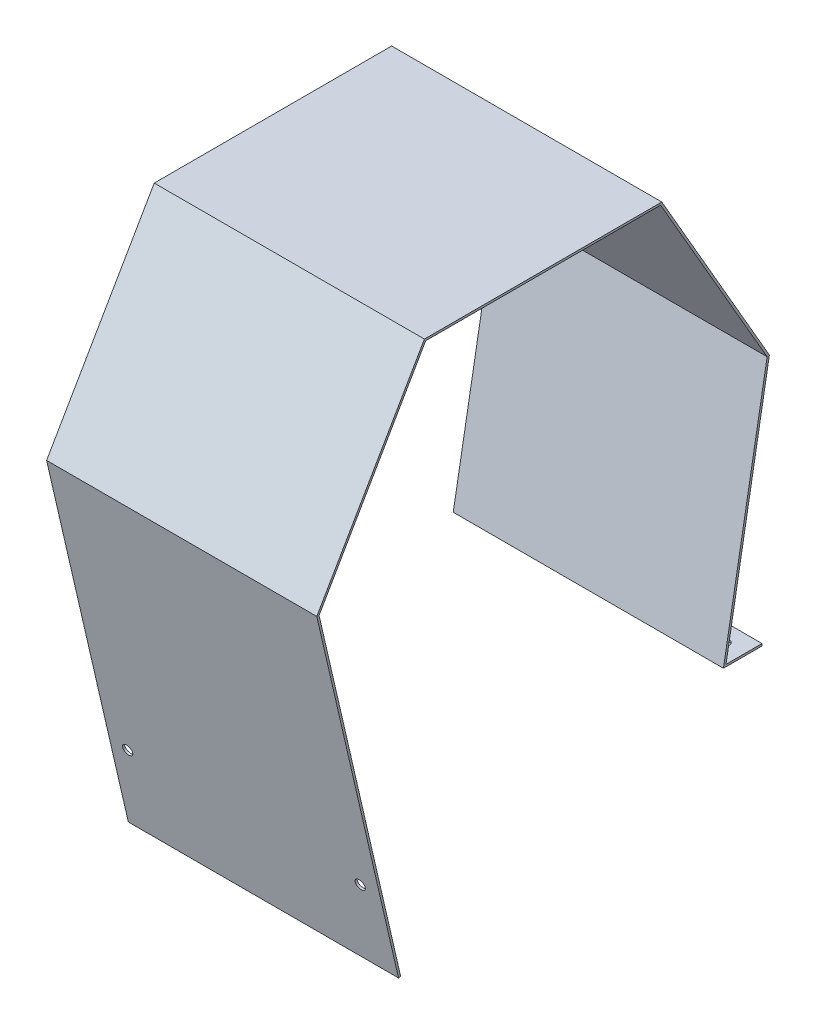
ISO-10303-21;
HEADER;
FILE_DESCRIPTION(('STEP AP214'),'2;1');
FILE_NAME('part.step','',(''),(''),'','','');
FILE_SCHEMA(('AUTOMOTIVE_DESIGN { 1 0 10303 214 1 1 1 1 }'));
ENDSEC;
DATA;
#1=APPLICATION_CONTEXT('core data for automotive mechanical design processes');
#2=APPLICATION_PROTOCOL_DEFINITION('international standard','automotive_design',2000,#1);
#3=PRODUCT_CONTEXT('',#1,'mechanical');
#4=PRODUCT('Part','Part','',(#3));
#5=PRODUCT_RELATED_PRODUCT_CATEGORY('part','',(#4));
#6=PRODUCT_DEFINITION_FORMATION('','',#4);
#7=PRODUCT_DEFINITION_CONTEXT('part definition',#1,'design');
#8=PRODUCT_DEFINITION('design','',#6,#7);
#9=PRODUCT_DEFINITION_SHAPE('','',#8);
#10=(LENGTH_UNIT() NAMED_UNIT(*) SI_UNIT(.MILLI.,.METRE.));
#11=(NAMED_UNIT(*) PLANE_ANGLE_UNIT() SI_UNIT($,.RADIAN.));
#12=(NAMED_UNIT(*) SI_UNIT($,.STERADIAN.) SOLID_ANGLE_UNIT());
#13=UNCERTAINTY_MEASURE_WITH_UNIT(LENGTH_MEASURE(1.E-05),#10,'distance_accuracy_value','');
#14=(GEOMETRIC_REPRESENTATION_CONTEXT(3) GLOBAL_UNCERTAINTY_ASSIGNED_CONTEXT((#13)) GLOBAL_UNIT_ASSIGNED_CONTEXT((#10,
#11,#12)) REPRESENTATION_CONTEXT('',''));
#15=CARTESIAN_POINT('',(0.,0.,0.));
#16=DIRECTION('',(0.,0.,1.));
#17=DIRECTION('',(1.,0.,0.));
#18=AXIS2_PLACEMENT_3D('',#15,#16,#17);
#19=CARTESIAN_POINT('',(-80.1675999299616,603.456840762097,-746.2089681282));
#20=DIRECTION('',(0.,-0.500000000000005,-0.866025403784436));
#21=DIRECTION('',(0.,0.866025403784436,-0.500000000000005));
#22=AXIS2_PLACEMENT_3D('',#19,#20,#21);
#23=PLANE('',#22);
#24=DIRECTION('',(1.,0.,0.));
#25=VECTOR('',#24,1.);
#26=CARTESIAN_POINT('',(-80.1675999299616,603.456840762097,-746.2089681282));
#27=LINE('',#26,#25);
#28=CARTESIAN_POINT('',(-80.1675999299616,603.456840762097,-746.2089681282));
#29=VERTEX_POINT('',#28);
#30=CARTESIAN_POINT('',(80.8324000700384,603.456840762097,-746.2089681282));
#31=VERTEX_POINT('',#30);
#32=EDGE_CURVE('E135',#29,#31,#27,.T.);
#33=ORIENTED_EDGE('',*,*,#32,.T.);
#34=DIRECTION('',(0.,0.866025403784436,-0.500000000000005));
#35=VECTOR('',#34,1.);
#36=CARTESIAN_POINT('',(80.8324000700384,603.456840762097,-746.2089681282));
#37=LINE('',#36,#35);
#38=CARTESIAN_POINT('',(80.8324000700384,493.471614481473,-682.7089681282));
#39=VERTEX_POINT('',#38);
#40=EDGE_CURVE('E138',#39,#31,#37,.T.);
#41=ORIENTED_EDGE('',*,*,#40,.F.);
#42=DIRECTION('',(1.,0.,0.));
#43=VECTOR('',#42,1.);
#44=CARTESIAN_POINT('',(-80.1675999299616,493.471614481473,-682.7089681282));
#45=LINE('',#44,#43);
#46=CARTESIAN_POINT('',(-80.1675999299616,493.471614481473,-682.7089681282));
#47=VERTEX_POINT('',#46);
#48=EDGE_CURVE('E11',#47,#39,#45,.T.);
#49=ORIENTED_EDGE('',*,*,#48,.F.);
#50=DIRECTION('',(0.,0.866025403784436,-0.500000000000005));
#51=VECTOR('',#50,1.);
#52=CARTESIAN_POINT('',(-80.1675999299616,603.456840762097,-746.2089681282));
#53=LINE('',#52,#51);
#54=EDGE_CURVE('E139',#47,#29,#53,.T.);
#55=ORIENTED_EDGE('',*,*,#54,.T.);
#56=EDGE_LOOP('',(#33,#41,#49,#55));
#57=FACE_BOUND('',#56,.T.);
#58=ADVANCED_FACE('F37',(#57),#23,.T.);
#59=CARTESIAN_POINT('',(-80.1675999299616,493.471614481473,-682.7089681282));
#60=DIRECTION('',(0.,0.224951054343861,-0.974370064785236));
#61=DIRECTION('',(0.,0.974370064785236,0.224951054343861));
#62=AXIS2_PLACEMENT_3D('',#59,#60,#61);
#63=PLANE('',#62);
#64=CARTESIAN_POINT('',(69.0000000001624,330.707852502616,-720.28594343705));
#65=DIRECTION('',(0.,0.224951054343861,-0.974370064785236));
#66=DIRECTION('',(0.,0.974370064785236,0.224951054343861));
#67=AXIS2_PLACEMENT_3D('',#64,#65,#66);
#68=CIRCLE('',#67,3.00000000000001);
#69=CARTESIAN_POINT('',(69.0000000001624,333.630962696971,-719.611090274018));
#70=VERTEX_POINT('',#69);
#71=EDGE_CURVE('E261',#70,#70,#68,.T.);
#72=ORIENTED_EDGE('',*,*,#71,.F.);
#73=EDGE_LOOP('',(#72));
#74=FACE_BOUND('',#73,.T.);
#75=CARTESIAN_POINT('',(-69.4999999998664,330.993163089172,-720.220074298022));
#76=DIRECTION('',(0.,0.224951054343861,-0.974370064785236));
#77=DIRECTION('',(0.,0.974370064785236,0.224951054343861));
#78=AXIS2_PLACEMENT_3D('',#75,#76,#77);
#79=CIRCLE('',#78,3.00000000000001);
#80=CARTESIAN_POINT('',(-69.4999999998664,333.916273283528,-719.545221134991));
#81=VERTEX_POINT('',#80);
#82=EDGE_CURVE('E265',#81,#81,#79,.T.);
#83=ORIENTED_EDGE('',*,*,#82,.F.);
#84=EDGE_LOOP('',(#83));
#85=FACE_BOUND('',#84,.T.);
#86=ORIENTED_EDGE('',*,*,#48,.T.);
#87=DIRECTION('',(0.,0.974370064785236,0.224951054343861));
#88=VECTOR('',#87,1.);
#89=CARTESIAN_POINT('',(80.8324000700384,493.471614481473,-682.7089681282));
#90=LINE('',#89,#88);
#91=CARTESIAN_POINT('',(80.8324000700383,283.007680487862,-731.298395866474));
#92=VERTEX_POINT('',#91);
#93=EDGE_CURVE('E157',#92,#39,#90,.T.);
#94=ORIENTED_EDGE('',*,*,#93,.F.);
#95=DIRECTION('',(1.,0.,0.));
#96=VECTOR('',#95,1.);
#97=CARTESIAN_POINT('',(-80.1675999299617,283.007680487862,-731.298395866474));
#98=LINE('',#97,#96);
#99=CARTESIAN_POINT('',(-80.1675999299617,283.007680487862,-731.298395866474));
#100=VERTEX_POINT('',#99);
#101=EDGE_CURVE('E45',#100,#92,#98,.T.);
#102=ORIENTED_EDGE('',*,*,#101,.F.);
#103=DIRECTION('',(0.,0.974370064785236,0.224951054343861));
#104=VECTOR('',#103,1.);
#105=CARTESIAN_POINT('',(-80.1675999299616,493.471614481473,-682.7089681282));
#106=LINE('',#105,#104);
#107=EDGE_CURVE('E144',#100,#47,#106,.T.);
#108=ORIENTED_EDGE('',*,*,#107,.T.);
#109=EDGE_LOOP('',(#86,#94,#102,#108));
#110=FACE_BOUND('',#109,.T.);
#111=ADVANCED_FACE('F294',(#74,#85,#110),#63,.T.);
#112=CARTESIAN_POINT('',(-80.1675999299617,283.007680487862,-731.298395866474));
#113=DIRECTION('',(0.,-0.974370064785224,-0.224951054343913));
#114=DIRECTION('',(0.,0.224951054343913,-0.974370064785224));
#115=AXIS2_PLACEMENT_3D('',#112,#113,#114);
#116=PLANE('',#115);
#117=ORIENTED_EDGE('',*,*,#101,.T.);
#118=DIRECTION('',(0.,0.224951054343913,-0.974370064785224));
#119=VECTOR('',#118,1.);
#120=CARTESIAN_POINT('',(80.8324000700383,283.007680487862,-731.298395866474));
#121=LINE('',#120,#119);
#122=CARTESIAN_POINT('',(80.8324000700383,282.721992648846,-730.060945884197));
#123=VERTEX_POINT('',#122);
#124=EDGE_CURVE('E193',#123,#92,#121,.T.);
#125=ORIENTED_EDGE('',*,*,#124,.F.);
#126=DIRECTION('',(1.,0.,0.));
#127=VECTOR('',#126,1.);
#128=CARTESIAN_POINT('',(-80.1675999299617,282.721992648846,-730.060945884197));
#129=LINE('',#128,#127);
#130=CARTESIAN_POINT('',(-80.1675999299617,282.721992648846,-730.060945884197));
#131=VERTEX_POINT('',#130);
#132=EDGE_CURVE('E233',#131,#123,#129,.T.);
#133=ORIENTED_EDGE('',*,*,#132,.F.);
#134=DIRECTION('',(0.,0.224951054343913,-0.974370064785224));
#135=VECTOR('',#134,1.);
#136=CARTESIAN_POINT('',(-80.1675999299617,283.007680487862,-731.298395866474));
#137=LINE('',#136,#135);
#138=EDGE_CURVE('E229',#131,#100,#137,.T.);
#139=ORIENTED_EDGE('',*,*,#138,.T.);
#140=EDGE_LOOP('',(#117,#125,#133,#139));
#141=FACE_BOUND('',#140,.T.);
#142=ADVANCED_FACE('F281',(#141),#116,.T.);
#143=CARTESIAN_POINT('',(-80.1675999299616,493.673371153525,-681.358982713378));
#144=DIRECTION('',(0.,-0.224951054343862,0.974370064785236));
#145=DIRECTION('',(0.,-0.974370064785236,-0.224951054343862));
#146=AXIS2_PLACEMENT_3D('',#143,#144,#145);
#147=PLANE('',#146);
#148=CARTESIAN_POINT('',(69.0000000001624,330.422164663599,-719.048493454772));
#149=DIRECTION('',(0.,-0.224951054343862,0.974370064785236));
#150=DIRECTION('',(0.,-0.974370064785236,-0.224951054343862));
#151=AXIS2_PLACEMENT_3D('',#148,#149,#150);
#152=CIRCLE('',#151,3.00000000000001);
#153=CARTESIAN_POINT('',(69.0000000001624,327.499054469243,-719.723346617804));
#154=VERTEX_POINT('',#153);
#155=EDGE_CURVE('E268',#154,#154,#152,.T.);
#156=ORIENTED_EDGE('',*,*,#155,.F.);
#157=EDGE_LOOP('',(#156));
#158=FACE_BOUND('',#157,.T.);
#159=CARTESIAN_POINT('',(-69.4999999998664,330.707475250155,-718.982624315745));
#160=DIRECTION('',(0.,-0.224951054343862,0.974370064785236));
#161=DIRECTION('',(0.,-0.974370064785236,-0.224951054343862));
#162=AXIS2_PLACEMENT_3D('',#159,#160,#161);
#163=CIRCLE('',#162,3.00000000000001);
#164=CARTESIAN_POINT('',(-69.4999999998664,327.7843650558,-719.657477478777));
#165=VERTEX_POINT('',#164);
#166=EDGE_CURVE('E269',#165,#165,#163,.T.);
#167=ORIENTED_EDGE('',*,*,#166,.F.);
#168=EDGE_LOOP('',(#167));
#169=FACE_BOUND('',#168,.T.);
#170=ORIENTED_EDGE('',*,*,#132,.T.);
#171=DIRECTION('',(0.,-0.974370064785236,-0.224951054343862));
#172=VECTOR('',#171,1.);
#173=CARTESIAN_POINT('',(80.8324000700384,493.673371153525,-681.358982713378));
#174=LINE('',#173,#172);
#175=CARTESIAN_POINT('',(80.8324000700384,493.673371153525,-681.358982713378));
#176=VERTEX_POINT('',#175);
#177=EDGE_CURVE('E190',#176,#123,#174,.T.);
#178=ORIENTED_EDGE('',*,*,#177,.F.);
#179=DIRECTION('',(1.,0.,0.));
#180=VECTOR('',#179,1.);
#181=CARTESIAN_POINT('',(-80.1675999299616,493.673371153525,-681.358982713378));
#182=LINE('',#181,#180);
#183=CARTESIAN_POINT('',(-80.1675999299616,493.673371153525,-681.358982713378));
#184=VERTEX_POINT('',#183);
#185=EDGE_CURVE('E235',#184,#176,#182,.T.);
#186=ORIENTED_EDGE('',*,*,#185,.F.);
#187=DIRECTION('',(0.,-0.974370064785236,-0.224951054343862));
#188=VECTOR('',#187,1.);
#189=CARTESIAN_POINT('',(-80.1675999299616,493.673371153525,-681.358982713378));
#190=LINE('',#189,#188);
#191=EDGE_CURVE('E226',#184,#131,#190,.T.);
#192=ORIENTED_EDGE('',*,*,#191,.T.);
#193=EDGE_LOOP('',(#170,#178,#186,#192));
#194=FACE_BOUND('',#193,.T.);
#195=ADVANCED_FACE('F277',(#158,#169,#194),#147,.T.);
#196=CARTESIAN_POINT('',(-80.1675999299616,604.726840762097,-745.475733286329));
#197=DIRECTION('',(0.,0.500000000000003,0.866025403784437));
#198=DIRECTION('',(0.,-0.866025403784437,0.500000000000003));
#199=AXIS2_PLACEMENT_3D('',#196,#197,#198);
#200=PLANE('',#199);
#201=ORIENTED_EDGE('',*,*,#185,.T.);
#202=DIRECTION('',(0.,-0.866025403784437,0.500000000000003));
#203=VECTOR('',#202,1.);
#204=CARTESIAN_POINT('',(80.8324000700384,604.726840762097,-745.475733286329));
#205=LINE('',#204,#203);
#206=CARTESIAN_POINT('',(80.8324000700384,604.726840762097,-745.475733286329));
#207=VERTEX_POINT('',#206);
#208=EDGE_CURVE('E187',#207,#176,#205,.T.);
#209=ORIENTED_EDGE('',*,*,#208,.F.);
#210=DIRECTION('',(1.,0.,0.));
#211=VECTOR('',#210,1.);
#212=CARTESIAN_POINT('',(-80.1675999299616,604.726840762097,-745.475733286329));
#213=LINE('',#212,#211);
#214=CARTESIAN_POINT('',(-80.1675999299616,604.726840762097,-745.475733286329));
#215=VERTEX_POINT('',#214);
#216=EDGE_CURVE('E237',#215,#207,#213,.T.);
#217=ORIENTED_EDGE('',*,*,#216,.F.);
#218=DIRECTION('',(0.,-0.866025403784437,0.500000000000003));
#219=VECTOR('',#218,1.);
#220=CARTESIAN_POINT('',(-80.1675999299616,604.726840762097,-745.475733286329));
#221=LINE('',#220,#219);
#222=EDGE_CURVE('E223',#215,#184,#221,.T.);
#223=ORIENTED_EDGE('',*,*,#222,.T.);
#224=EDGE_LOOP('',(#201,#209,#217,#223));
#225=FACE_BOUND('',#224,.T.);
#226=ADVANCED_FACE('F280',(#225),#200,.T.);
#227=CARTESIAN_POINT('',(-80.1675999299616,604.726840762097,-745.475733286329));
#228=DIRECTION('',(0.,1.,0.));
#229=DIRECTION('',(-1.,0.,0.));
#230=AXIS2_PLACEMENT_3D('',#227,#228,#229);
#231=PLANE('',#230);
#232=ORIENTED_EDGE('',*,*,#216,.T.);
#233=DIRECTION('',(0.,0.,1.));
#234=VECTOR('',#233,1.);
#235=CARTESIAN_POINT('',(80.8324000700384,604.726840762097,-745.475733286329));
#236=LINE('',#235,#234);
#237=CARTESIAN_POINT('',(80.8324000700384,604.726840762097,-886.942202970071));
#238=VERTEX_POINT('',#237);
#239=EDGE_CURVE('E184',#238,#207,#236,.T.);
#240=ORIENTED_EDGE('',*,*,#239,.F.);
#241=DIRECTION('',(1.,0.,0.));
#242=VECTOR('',#241,1.);
#243=CARTESIAN_POINT('',(-80.1675999299616,604.726840762097,-886.942202970071));
#244=LINE('',#243,#242);
#245=CARTESIAN_POINT('',(-80.1675999299616,604.726840762097,-886.942202970071));
#246=VERTEX_POINT('',#245);
#247=EDGE_CURVE('E239',#246,#238,#244,.T.);
#248=ORIENTED_EDGE('',*,*,#247,.F.);
#249=DIRECTION('',(0.,0.,1.));
#250=VECTOR('',#249,1.);
#251=CARTESIAN_POINT('',(-80.1675999299616,604.726840762097,-745.475733286329));
#252=LINE('',#251,#250);
#253=EDGE_CURVE('E220',#246,#215,#252,.T.);
#254=ORIENTED_EDGE('',*,*,#253,.T.);
#255=EDGE_LOOP('',(#232,#240,#248,#254));
#256=FACE_BOUND('',#255,.T.);
#257=ADVANCED_FACE('F310',(#256),#231,.T.);
#258=CARTESIAN_POINT('',(-80.1675999299616,604.726840762097,-886.942202970071));
#259=DIRECTION('',(0.,0.499999999999999,-0.866025403784439));
#260=DIRECTION('',(0.,0.866025403784439,0.499999999999999));
#261=AXIS2_PLACEMENT_3D('',#258,#259,#260);
#262=PLANE('',#261);
#263=ORIENTED_EDGE('',*,*,#247,.T.);
#264=DIRECTION('',(0.,0.866025403784439,0.499999999999999));
#265=VECTOR('',#264,1.);
#266=CARTESIAN_POINT('',(80.8324000700384,604.726840762097,-886.942202970071));
#267=LINE('',#266,#265);
#268=CARTESIAN_POINT('',(80.8324000700384,493.706300995722,-951.039941489765));
#269=VERTEX_POINT('',#268);
#270=EDGE_CURVE('E181',#269,#238,#267,.T.);
#271=ORIENTED_EDGE('',*,*,#270,.F.);
#272=DIRECTION('',(1.,0.,0.));
#273=VECTOR('',#272,1.);
#274=CARTESIAN_POINT('',(-80.1675999299616,493.706300995722,-951.039941489765));
#275=LINE('',#274,#273);
#276=CARTESIAN_POINT('',(-80.1675999299616,493.706300995722,-951.039941489765));
#277=VERTEX_POINT('',#276);
#278=EDGE_CURVE('E241',#277,#269,#275,.T.);
#279=ORIENTED_EDGE('',*,*,#278,.F.);
#280=DIRECTION('',(0.,0.866025403784439,0.499999999999999));
#281=VECTOR('',#280,1.);
#282=CARTESIAN_POINT('',(-80.1675999299616,604.726840762097,-886.942202970071));
#283=LINE('',#282,#281);
#284=EDGE_CURVE('E217',#277,#246,#283,.T.);
#285=ORIENTED_EDGE('',*,*,#284,.T.);
#286=EDGE_LOOP('',(#263,#271,#279,#285));
#287=FACE_BOUND('',#286,.T.);
#288=ADVANCED_FACE('F314',(#287),#262,.T.);
#289=CARTESIAN_POINT('',(-80.1675999299616,493.706300995722,-951.039941489765));
#290=DIRECTION('',(0.,-0.173648177666935,-0.984807753012207));
#291=DIRECTION('',(0.,0.984807753012207,-0.173648177666935));
#292=AXIS2_PLACEMENT_3D('',#289,#290,#291);
#293=PLANE('',#292);
#294=ORIENTED_EDGE('',*,*,#278,.T.);
#295=DIRECTION('',(0.,0.984807753012207,-0.173648177666935));
#296=VECTOR('',#295,1.);
#297=CARTESIAN_POINT('',(80.8324000700384,493.706300995722,-951.039941489765));
#298=LINE('',#297,#296);
#299=CARTESIAN_POINT('',(80.8324000700384,347.020451529642,-925.175268540754));
#300=VERTEX_POINT('',#299);
#301=EDGE_CURVE('E178',#300,#269,#298,.T.);
#302=ORIENTED_EDGE('',*,*,#301,.F.);
#303=DIRECTION('',(1.,0.,0.));
#304=VECTOR('',#303,1.);
#305=CARTESIAN_POINT('',(-80.1675999299616,347.020451529642,-925.175268540754));
#306=LINE('',#305,#304);
#307=CARTESIAN_POINT('',(-80.1675999299616,347.020451529642,-925.175268540754));
#308=VERTEX_POINT('',#307);
#309=EDGE_CURVE('E243',#308,#300,#306,.T.);
#310=ORIENTED_EDGE('',*,*,#309,.F.);
#311=DIRECTION('',(0.,0.984807753012207,-0.173648177666935));
#312=VECTOR('',#311,1.);
#313=CARTESIAN_POINT('',(-80.1675999299616,493.706300995722,-951.039941489765));
#314=LINE('',#313,#312);
#315=EDGE_CURVE('E214',#308,#277,#314,.T.);
#316=ORIENTED_EDGE('',*,*,#315,.T.);
#317=EDGE_LOOP('',(#294,#302,#310,#316));
#318=FACE_BOUND('',#317,.T.);
#319=ADVANCED_FACE('F318',(#318),#293,.T.);
#320=CARTESIAN_POINT('',(-80.1675999299616,347.020451529642,-925.175268540754));
#321=DIRECTION('',(0.,1.,0.));
#322=DIRECTION('',(-1.,0.,0.));
#323=AXIS2_PLACEMENT_3D('',#320,#321,#322);
#324=PLANE('',#323);
#325=CARTESIAN_POINT('',(-69.4999999998664,347.020451529642,-935.918505009457));
#326=DIRECTION('',(0.,1.,0.));
#327=DIRECTION('',(-1.,0.,0.));
#328=AXIS2_PLACEMENT_3D('',#325,#326,#327);
#329=CIRCLE('',#328,3.00000000000001);
#330=CARTESIAN_POINT('',(-72.4999999998664,347.020451529642,-935.918505009457));
#331=VERTEX_POINT('',#330);
#332=EDGE_CURVE('E254',#331,#331,#329,.T.);
#333=ORIENTED_EDGE('',*,*,#332,.F.);
#334=EDGE_LOOP('',(#333));
#335=FACE_BOUND('',#334,.T.);
#336=CARTESIAN_POINT('',(69.0000000005084,347.020451529642,-935.918505009457));
#337=DIRECTION('',(0.,1.,0.));
#338=DIRECTION('',(-1.,0.,0.));
#339=AXIS2_PLACEMENT_3D('',#336,#337,#338);
#340=CIRCLE('',#339,3.00000000000001);
#341=CARTESIAN_POINT('',(66.0000000005084,347.020451529642,-935.918505009457));
#342=VERTEX_POINT('',#341);
#343=EDGE_CURVE('E162',#342,#342,#340,.T.);
#344=ORIENTED_EDGE('',*,*,#343,.F.);
#345=EDGE_LOOP('',(#344));
#346=FACE_BOUND('',#345,.T.);
#347=ORIENTED_EDGE('',*,*,#309,.T.);
#348=DIRECTION('',(0.,0.,1.));
#349=VECTOR('',#348,1.);
#350=CARTESIAN_POINT('',(80.8324000700384,347.020451529642,-925.175268540754));
#351=LINE('',#350,#349);
#352=CARTESIAN_POINT('',(80.8324000700384,347.020451529642,-946.66174147816));
#353=VERTEX_POINT('',#352);
#354=EDGE_CURVE('E175',#353,#300,#351,.T.);
#355=ORIENTED_EDGE('',*,*,#354,.F.);
#356=DIRECTION('',(1.,0.,0.));
#357=VECTOR('',#356,1.);
#358=CARTESIAN_POINT('',(-80.1675999299616,347.020451529642,-946.66174147816));
#359=LINE('',#358,#357);
#360=CARTESIAN_POINT('',(-80.1675999299616,347.020451529642,-946.66174147816));
#361=VERTEX_POINT('',#360);
#362=EDGE_CURVE('E245',#361,#353,#359,.T.);
#363=ORIENTED_EDGE('',*,*,#362,.F.);
#364=DIRECTION('',(0.,0.,1.));
#365=VECTOR('',#364,1.);
#366=CARTESIAN_POINT('',(-80.1675999299616,347.020451529642,-925.175268540754));
#367=LINE('',#366,#365);
#368=EDGE_CURVE('E211',#361,#308,#367,.T.);
#369=ORIENTED_EDGE('',*,*,#368,.T.);
#370=EDGE_LOOP('',(#347,#355,#363,#369));
#371=FACE_BOUND('',#370,.T.);
#372=ADVANCED_FACE('F322',(#335,#346,#371),#324,.T.);
#373=CARTESIAN_POINT('',(-80.1675999299616,347.020451529642,-946.66174147816));
#374=DIRECTION('',(0.,0.,-1.));
#375=DIRECTION('',(-1.,0.,0.));
#376=AXIS2_PLACEMENT_3D('',#373,#374,#375);
#377=PLANE('',#376);
#378=ORIENTED_EDGE('',*,*,#362,.T.);
#379=DIRECTION('',(0.,1.,0.));
#380=VECTOR('',#379,1.);
#381=CARTESIAN_POINT('',(80.8324000700384,347.020451529642,-946.66174147816));
#382=LINE('',#381,#380);
#383=CARTESIAN_POINT('',(80.8324000700384,345.750451529642,-946.66174147816));
#384=VERTEX_POINT('',#383);
#385=EDGE_CURVE('E172',#384,#353,#382,.T.);
#386=ORIENTED_EDGE('',*,*,#385,.F.);
#387=DIRECTION('',(1.,0.,0.));
#388=VECTOR('',#387,1.);
#389=CARTESIAN_POINT('',(-80.1675999299616,345.750451529642,-946.66174147816));
#390=LINE('',#389,#388);
#391=CARTESIAN_POINT('',(-80.1675999299616,345.750451529642,-946.66174147816));
#392=VERTEX_POINT('',#391);
#393=EDGE_CURVE('E247',#392,#384,#390,.T.);
#394=ORIENTED_EDGE('',*,*,#393,.F.);
#395=DIRECTION('',(0.,1.,0.));
#396=VECTOR('',#395,1.);
#397=CARTESIAN_POINT('',(-80.1675999299616,347.020451529642,-946.66174147816));
#398=LINE('',#397,#396);
#399=EDGE_CURVE('E208',#392,#361,#398,.T.);
#400=ORIENTED_EDGE('',*,*,#399,.T.);
#401=EDGE_LOOP('',(#378,#386,#394,#400));
#402=FACE_BOUND('',#401,.T.);
#403=ADVANCED_FACE('F326',(#402),#377,.T.);
#404=CARTESIAN_POINT('',(-80.1675999299616,345.750451529642,-923.66174147816));
#405=DIRECTION('',(0.,-1.,0.));
#406=DIRECTION('',(0.,0.,-1.));
#407=AXIS2_PLACEMENT_3D('',#404,#405,#406);
#408=PLANE('',#407);
#409=CARTESIAN_POINT('',(-69.4999999998664,345.750451529642,-935.918505009457));
#410=DIRECTION('',(0.,-1.,0.));
#411=DIRECTION('',(0.,0.,-1.));
#412=AXIS2_PLACEMENT_3D('',#409,#410,#411);
#413=CIRCLE('',#412,3.00000000000001);
#414=CARTESIAN_POINT('',(-69.4999999998664,345.750451529642,-938.918505009457));
#415=VERTEX_POINT('',#414);
#416=EDGE_CURVE('E40',#415,#415,#413,.T.);
#417=ORIENTED_EDGE('',*,*,#416,.F.);
#418=EDGE_LOOP('',(#417));
#419=FACE_BOUND('',#418,.T.);
#420=CARTESIAN_POINT('',(69.0000000005084,345.750451529642,-935.918505009457));
#421=DIRECTION('',(0.,-1.,0.));
#422=DIRECTION('',(0.,0.,-1.));
#423=AXIS2_PLACEMENT_3D('',#420,#421,#422);
#424=CIRCLE('',#423,3.00000000000001);
#425=CARTESIAN_POINT('',(69.0000000005084,345.750451529642,-938.918505009457));
#426=VERTEX_POINT('',#425);
#427=EDGE_CURVE('E160',#426,#426,#424,.T.);
#428=ORIENTED_EDGE('',*,*,#427,.F.);
#429=EDGE_LOOP('',(#428));
#430=FACE_BOUND('',#429,.T.);
#431=ORIENTED_EDGE('',*,*,#393,.T.);
#432=DIRECTION('',(0.,0.,-1.));
#433=VECTOR('',#432,1.);
#434=CARTESIAN_POINT('',(80.8324000700384,345.750451529642,-923.66174147816));
#435=LINE('',#434,#433);
#436=CARTESIAN_POINT('',(80.8324000700384,345.750451529642,-923.66174147816));
#437=VERTEX_POINT('',#436);
#438=EDGE_CURVE('E169',#437,#384,#435,.T.);
#439=ORIENTED_EDGE('',*,*,#438,.F.);
#440=DIRECTION('',(1.,0.,0.));
#441=VECTOR('',#440,1.);
#442=CARTESIAN_POINT('',(-80.1675999299616,345.750451529642,-923.66174147816));
#443=LINE('',#442,#441);
#444=CARTESIAN_POINT('',(-80.1675999299616,345.750451529642,-923.66174147816));
#445=VERTEX_POINT('',#444);
#446=EDGE_CURVE('E249',#445,#437,#443,.T.);
#447=ORIENTED_EDGE('',*,*,#446,.F.);
#448=DIRECTION('',(0.,0.,-1.));
#449=VECTOR('',#448,1.);
#450=CARTESIAN_POINT('',(-80.1675999299616,345.750451529642,-923.66174147816));
#451=LINE('',#450,#449);
#452=EDGE_CURVE('E205',#445,#392,#451,.T.);
#453=ORIENTED_EDGE('',*,*,#452,.T.);
#454=EDGE_LOOP('',(#431,#439,#447,#453));
#455=FACE_BOUND('',#454,.T.);
#456=ADVANCED_FACE('F330',(#419,#430,#455),#408,.T.);
#457=CARTESIAN_POINT('',(-80.1675999299616,493.471614481473,-949.7089681282));
#458=DIRECTION('',(0.,0.173648177666936,0.984807753012207));
#459=DIRECTION('',(0.,-0.984807753012207,0.173648177666936));
#460=AXIS2_PLACEMENT_3D('',#457,#458,#459);
#461=PLANE('',#460);
#462=ORIENTED_EDGE('',*,*,#446,.T.);
#463=DIRECTION('',(0.,-0.984807753012207,0.173648177666936));
#464=VECTOR('',#463,1.);
#465=CARTESIAN_POINT('',(80.8324000700384,493.471614481473,-949.7089681282));
#466=LINE('',#465,#464);
#467=CARTESIAN_POINT('',(80.8324000700384,493.471614481473,-949.7089681282));
#468=VERTEX_POINT('',#467);
#469=EDGE_CURVE('E166',#468,#437,#466,.T.);
#470=ORIENTED_EDGE('',*,*,#469,.F.);
#471=DIRECTION('',(1.,0.,0.));
#472=VECTOR('',#471,1.);
#473=CARTESIAN_POINT('',(-80.1675999299616,493.471614481473,-949.7089681282));
#474=LINE('',#473,#472);
#475=CARTESIAN_POINT('',(-80.1675999299616,493.471614481473,-949.7089681282));
#476=VERTEX_POINT('',#475);
#477=EDGE_CURVE('E251',#476,#468,#474,.T.);
#478=ORIENTED_EDGE('',*,*,#477,.F.);
#479=DIRECTION('',(0.,-0.984807753012207,0.173648177666936));
#480=VECTOR('',#479,1.);
#481=CARTESIAN_POINT('',(-80.1675999299616,493.471614481473,-949.7089681282));
#482=LINE('',#481,#480);
#483=EDGE_CURVE('E202',#476,#445,#482,.T.);
#484=ORIENTED_EDGE('',*,*,#483,.T.);
#485=EDGE_LOOP('',(#462,#470,#478,#484));
#486=FACE_BOUND('',#485,.T.);
#487=ADVANCED_FACE('F334',(#486),#461,.T.);
#488=CARTESIAN_POINT('',(-80.1675999299616,603.456840762097,-886.2089681282));
#489=DIRECTION('',(0.,-0.499999999999998,0.86602540378444));
#490=DIRECTION('',(0.,-0.86602540378444,-0.499999999999998));
#491=AXIS2_PLACEMENT_3D('',#488,#489,#490);
#492=PLANE('',#491);
#493=ORIENTED_EDGE('',*,*,#477,.T.);
#494=DIRECTION('',(0.,-0.86602540378444,-0.499999999999998));
#495=VECTOR('',#494,1.);
#496=CARTESIAN_POINT('',(80.8324000700384,603.456840762097,-886.2089681282));
#497=LINE('',#496,#495);
#498=CARTESIAN_POINT('',(80.8324000700384,603.456840762097,-886.2089681282));
#499=VERTEX_POINT('',#498);
#500=EDGE_CURVE('E152',#499,#468,#497,.T.);
#501=ORIENTED_EDGE('',*,*,#500,.F.);
#502=DIRECTION('',(1.,0.,0.));
#503=VECTOR('',#502,1.);
#504=CARTESIAN_POINT('',(-80.1675999299616,603.456840762097,-886.2089681282));
#505=LINE('',#504,#503);
#506=CARTESIAN_POINT('',(-80.1675999299616,603.456840762097,-886.2089681282));
#507=VERTEX_POINT('',#506);
#508=EDGE_CURVE('E143',#507,#499,#505,.T.);
#509=ORIENTED_EDGE('',*,*,#508,.F.);
#510=DIRECTION('',(0.,-0.86602540378444,-0.499999999999998));
#511=VECTOR('',#510,1.);
#512=CARTESIAN_POINT('',(-80.1675999299616,603.456840762097,-886.2089681282));
#513=LINE('',#512,#511);
#514=EDGE_CURVE('E199',#507,#476,#513,.T.);
#515=ORIENTED_EDGE('',*,*,#514,.T.);
#516=EDGE_LOOP('',(#493,#501,#509,#515));
#517=FACE_BOUND('',#516,.T.);
#518=ADVANCED_FACE('F338',(#517),#492,.T.);
#519=CARTESIAN_POINT('',(-80.1675999299616,603.456840762097,-746.2089681282));
#520=DIRECTION('',(0.,-1.,0.));
#521=DIRECTION('',(1.,0.,0.));
#522=AXIS2_PLACEMENT_3D('',#519,#520,#521);
#523=PLANE('',#522);
#524=ORIENTED_EDGE('',*,*,#508,.T.);
#525=DIRECTION('',(0.,0.,-1.));
#526=VECTOR('',#525,1.);
#527=CARTESIAN_POINT('',(80.8324000700384,603.456840762097,-746.2089681282));
#528=LINE('',#527,#526);
#529=EDGE_CURVE('E147',#31,#499,#528,.T.);
#530=ORIENTED_EDGE('',*,*,#529,.F.);
#531=ORIENTED_EDGE('',*,*,#32,.F.);
#532=DIRECTION('',(0.,0.,-1.));
#533=VECTOR('',#532,1.);
#534=CARTESIAN_POINT('',(-80.1675999299616,603.456840762097,-746.2089681282));
#535=LINE('',#534,#533);
#536=EDGE_CURVE('E197',#29,#507,#535,.T.);
#537=ORIENTED_EDGE('',*,*,#536,.T.);
#538=EDGE_LOOP('',(#524,#530,#531,#537));
#539=FACE_BOUND('',#538,.T.);
#540=ADVANCED_FACE('F148',(#539),#523,.T.);
#541=CARTESIAN_POINT('',(-80.1675999299617,0.,0.));
#542=DIRECTION('',(1.,0.,0.));
#543=DIRECTION('',(0.,1.,0.));
#544=AXIS2_PLACEMENT_3D('',#541,#542,#543);
#545=PLANE('',#544);
#546=ORIENTED_EDGE('',*,*,#54,.F.);
#547=ORIENTED_EDGE('',*,*,#107,.F.);
#548=ORIENTED_EDGE('',*,*,#138,.F.);
#549=ORIENTED_EDGE('',*,*,#191,.F.);
#550=ORIENTED_EDGE('',*,*,#222,.F.);
#551=ORIENTED_EDGE('',*,*,#253,.F.);
#552=ORIENTED_EDGE('',*,*,#284,.F.);
#553=ORIENTED_EDGE('',*,*,#315,.F.);
#554=ORIENTED_EDGE('',*,*,#368,.F.);
#555=ORIENTED_EDGE('',*,*,#399,.F.);
#556=ORIENTED_EDGE('',*,*,#452,.F.);
#557=ORIENTED_EDGE('',*,*,#483,.F.);
#558=ORIENTED_EDGE('',*,*,#514,.F.);
#559=ORIENTED_EDGE('',*,*,#536,.F.);
#560=EDGE_LOOP('',(#546,#547,#548,#549,#550,#551,#552,#553,#554,#555,#556,#557,#558,#559));
#561=FACE_BOUND('',#560,.T.);
#562=ADVANCED_FACE('F293',(#561),#545,.F.);
#563=CARTESIAN_POINT('',(80.8324000700383,0.,0.));
#564=DIRECTION('',(1.,0.,0.));
#565=DIRECTION('',(0.,1.,0.));
#566=AXIS2_PLACEMENT_3D('',#563,#564,#565);
#567=PLANE('',#566);
#568=ORIENTED_EDGE('',*,*,#40,.T.);
#569=ORIENTED_EDGE('',*,*,#529,.T.);
#570=ORIENTED_EDGE('',*,*,#500,.T.);
#571=ORIENTED_EDGE('',*,*,#469,.T.);
#572=ORIENTED_EDGE('',*,*,#438,.T.);
#573=ORIENTED_EDGE('',*,*,#385,.T.);
#574=ORIENTED_EDGE('',*,*,#354,.T.);
#575=ORIENTED_EDGE('',*,*,#301,.T.);
#576=ORIENTED_EDGE('',*,*,#270,.T.);
#577=ORIENTED_EDGE('',*,*,#239,.T.);
#578=ORIENTED_EDGE('',*,*,#208,.T.);
#579=ORIENTED_EDGE('',*,*,#177,.T.);
#580=ORIENTED_EDGE('',*,*,#124,.T.);
#581=ORIENTED_EDGE('',*,*,#93,.T.);
#582=EDGE_LOOP('',(#568,#569,#570,#571,#572,#573,#574,#575,#576,#577,#578,#579,#580,#581));
#583=FACE_BOUND('',#582,.T.);
#584=ADVANCED_FACE('F155',(#583),#567,.T.);
#585=CARTESIAN_POINT('',(69.0000000005084,337.020451529642,-935.918505009457));
#586=DIRECTION('',(0.,1.,0.));
#587=DIRECTION('',(-1.,0.,0.));
#588=AXIS2_PLACEMENT_3D('',#585,#586,#587);
#589=CYLINDRICAL_SURFACE('',#588,3.00000000000001);
#590=ORIENTED_EDGE('',*,*,#427,.T.);
#591=EDGE_LOOP('',(#590));
#592=FACE_BOUND('',#591,.T.);
#593=ORIENTED_EDGE('',*,*,#343,.T.);
#594=EDGE_LOOP('',(#593));
#595=FACE_BOUND('',#594,.T.);
#596=ADVANCED_FACE('F349',(#592,#595),#589,.F.);
#597=CARTESIAN_POINT('',(-69.4999999998664,337.020451529642,-935.918505009457));
#598=DIRECTION('',(0.,1.,0.));
#599=DIRECTION('',(-1.,0.,0.));
#600=AXIS2_PLACEMENT_3D('',#597,#598,#599);
#601=CYLINDRICAL_SURFACE('',#600,3.00000000000001);
#602=ORIENTED_EDGE('',*,*,#416,.T.);
#603=EDGE_LOOP('',(#602));
#604=FACE_BOUND('',#603,.T.);
#605=ORIENTED_EDGE('',*,*,#332,.T.);
#606=EDGE_LOOP('',(#605));
#607=FACE_BOUND('',#606,.T.);
#608=ADVANCED_FACE('F353',(#604,#607),#601,.F.);
#609=CARTESIAN_POINT('',(-69.4999999998664,332.956985793594,-728.726324963598));
#610=DIRECTION('',(0.,-0.224951054343862,0.974370064785236));
#611=DIRECTION('',(0.,-0.974370064785236,-0.224951054343862));
#612=AXIS2_PLACEMENT_3D('',#609,#610,#611);
#613=CYLINDRICAL_SURFACE('',#612,3.00000000000001);
#614=ORIENTED_EDGE('',*,*,#82,.T.);
#615=EDGE_LOOP('',(#614));
#616=FACE_BOUND('',#615,.T.);
#617=ORIENTED_EDGE('',*,*,#166,.T.);
#618=EDGE_LOOP('',(#617));
#619=FACE_BOUND('',#618,.T.);
#620=ADVANCED_FACE('F358',(#616,#619),#613,.F.);
#621=CARTESIAN_POINT('',(69.0000000001624,332.671675207038,-728.792194102625));
#622=DIRECTION('',(0.,-0.224951054343862,0.974370064785236));
#623=DIRECTION('',(0.,-0.974370064785236,-0.224951054343862));
#624=AXIS2_PLACEMENT_3D('',#621,#622,#623);
#625=CYLINDRICAL_SURFACE('',#624,3.00000000000001);
#626=ORIENTED_EDGE('',*,*,#71,.T.);
#627=EDGE_LOOP('',(#626));
#628=FACE_BOUND('',#627,.T.);
#629=ORIENTED_EDGE('',*,*,#155,.T.);
#630=EDGE_LOOP('',(#629));
#631=FACE_BOUND('',#630,.T.);
#632=ADVANCED_FACE('F275',(#628,#631),#625,.F.);
#633=CLOSED_SHELL('',(#58,#111,#142,#195,#226,#257,#288,#319,#372,#403,#456,#487,#518,#540,#562,
#584,#596,#608,#620,#632));
#634=MANIFOLD_SOLID_BREP('B2',#633);
#635=ADVANCED_BREP_SHAPE_REPRESENTATION('',(#18,#634),#14);
#636=SHAPE_DEFINITION_REPRESENTATION(#9,#635);
ENDSEC;
END-ISO-10303-21;
